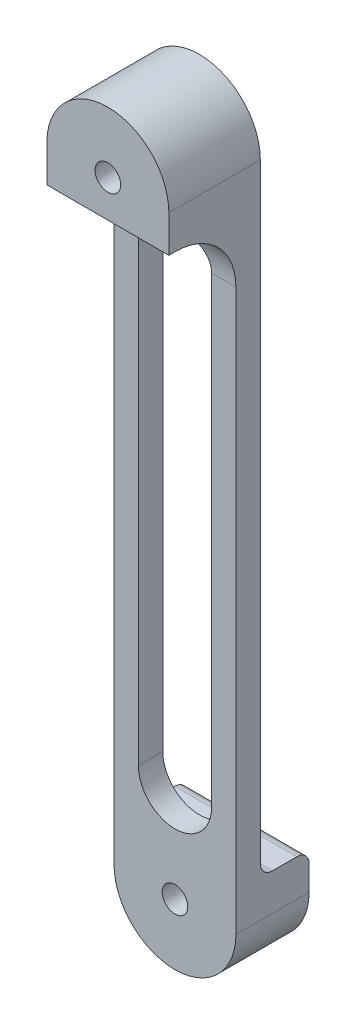
ISO-10303-21;
HEADER;
FILE_DESCRIPTION(('STEP AP214'),'2;1');
FILE_NAME('part.step','',(''),(''),'','','');
FILE_SCHEMA(('AUTOMOTIVE_DESIGN { 1 0 10303 214 1 1 1 1 }'));
ENDSEC;
DATA;
#1=APPLICATION_CONTEXT('core data for automotive mechanical design processes');
#2=APPLICATION_PROTOCOL_DEFINITION('international standard','automotive_design',2000,#1);
#3=PRODUCT_CONTEXT('',#1,'mechanical');
#4=PRODUCT('Part','Part','',(#3));
#5=PRODUCT_RELATED_PRODUCT_CATEGORY('part','',(#4));
#6=PRODUCT_DEFINITION_FORMATION('','',#4);
#7=PRODUCT_DEFINITION_CONTEXT('part definition',#1,'design');
#8=PRODUCT_DEFINITION('design','',#6,#7);
#9=PRODUCT_DEFINITION_SHAPE('','',#8);
#10=(LENGTH_UNIT() NAMED_UNIT(*) SI_UNIT(.MILLI.,.METRE.));
#11=(NAMED_UNIT(*) PLANE_ANGLE_UNIT() SI_UNIT($,.RADIAN.));
#12=(NAMED_UNIT(*) SI_UNIT($,.STERADIAN.) SOLID_ANGLE_UNIT());
#13=UNCERTAINTY_MEASURE_WITH_UNIT(LENGTH_MEASURE(1.E-05),#10,'distance_accuracy_value','');
#14=(GEOMETRIC_REPRESENTATION_CONTEXT(3) GLOBAL_UNCERTAINTY_ASSIGNED_CONTEXT((#13)) GLOBAL_UNIT_ASSIGNED_CONTEXT((#10,
#11,#12)) REPRESENTATION_CONTEXT('',''));
#15=CARTESIAN_POINT('',(0.,0.,0.));
#16=DIRECTION('',(0.,0.,1.));
#17=DIRECTION('',(1.,0.,0.));
#18=AXIS2_PLACEMENT_3D('',#15,#16,#17);
#19=CARTESIAN_POINT('',(0.,0.,4.));
#20=DIRECTION('',(0.,0.,1.));
#21=DIRECTION('',(1.,0.,0.));
#22=AXIS2_PLACEMENT_3D('',#19,#20,#21);
#23=PLANE('',#22);
#24=CARTESIAN_POINT('',(0.,-54.,4.));
#25=DIRECTION('',(0.,0.,1.));
#26=DIRECTION('',(1.,0.,0.));
#27=AXIS2_PLACEMENT_3D('',#24,#25,#26);
#28=CIRCLE('',#27,2.1);
#29=CARTESIAN_POINT('',(2.09999999999999,-54.,4.));
#30=VERTEX_POINT('',#29);
#31=EDGE_CURVE('E345',#30,#30,#28,.T.);
#32=ORIENTED_EDGE('',*,*,#31,.F.);
#33=EDGE_LOOP('',(#32));
#34=FACE_BOUND('',#33,.T.);
#35=DIRECTION('',(0.,-1.,0.));
#36=VECTOR('',#35,1.);
#37=CARTESIAN_POINT('',(10.,0.,4.));
#38=LINE('',#37,#36);
#39=CARTESIAN_POINT('',(10.,37.95,4.));
#40=VERTEX_POINT('',#39);
#41=CARTESIAN_POINT('',(9.99999999999999,-54.,4.));
#42=VERTEX_POINT('',#41);
#43=EDGE_CURVE('E350',#40,#42,#38,.T.);
#44=ORIENTED_EDGE('',*,*,#43,.F.);
#45=DIRECTION('',(-1.,0.,0.));
#46=VECTOR('',#45,1.);
#47=CARTESIAN_POINT('',(0.,37.95,4.));
#48=LINE('',#47,#46);
#49=CARTESIAN_POINT('',(5.99999999999999,37.95,4.));
#50=VERTEX_POINT('',#49);
#51=EDGE_CURVE('E450',#40,#50,#48,.T.);
#52=ORIENTED_EDGE('',*,*,#51,.T.);
#53=DIRECTION('',(0.,-1.,0.));
#54=VECTOR('',#53,1.);
#55=CARTESIAN_POINT('',(5.99999999999999,0.,4.));
#56=LINE('',#55,#54);
#57=CARTESIAN_POINT('',(5.99999999999999,-38.,4.));
#58=VERTEX_POINT('',#57);
#59=EDGE_CURVE('E363',#50,#58,#56,.T.);
#60=ORIENTED_EDGE('',*,*,#59,.T.);
#61=CARTESIAN_POINT('',(0.,-38.,4.));
#62=DIRECTION('',(0.,0.,1.));
#63=DIRECTION('',(1.,0.,0.));
#64=AXIS2_PLACEMENT_3D('',#61,#62,#63);
#65=CIRCLE('',#64,6.00000000000001);
#66=CARTESIAN_POINT('',(-6.00000000000002,-38.,4.));
#67=VERTEX_POINT('',#66);
#68=EDGE_CURVE('E354',#67,#58,#65,.T.);
#69=ORIENTED_EDGE('',*,*,#68,.F.);
#70=DIRECTION('',(0.,-1.,0.));
#71=VECTOR('',#70,1.);
#72=CARTESIAN_POINT('',(-6.00000000000002,0.,4.));
#73=LINE('',#72,#71);
#74=CARTESIAN_POINT('',(-6.00000000000002,37.95,4.));
#75=VERTEX_POINT('',#74);
#76=EDGE_CURVE('E356',#75,#67,#73,.T.);
#77=ORIENTED_EDGE('',*,*,#76,.F.);
#78=DIRECTION('',(-1.,0.,0.));
#79=VECTOR('',#78,1.);
#80=CARTESIAN_POINT('',(0.,37.95,4.));
#81=LINE('',#80,#79);
#82=CARTESIAN_POINT('',(-9.99999999999999,37.95,4.));
#83=VERTEX_POINT('',#82);
#84=EDGE_CURVE('E443',#75,#83,#81,.T.);
#85=ORIENTED_EDGE('',*,*,#84,.T.);
#86=DIRECTION('',(0.,-1.,0.));
#87=VECTOR('',#86,1.);
#88=CARTESIAN_POINT('',(-9.99999999999999,0.,4.));
#89=LINE('',#88,#87);
#90=CARTESIAN_POINT('',(-9.99999999999999,-54.,4.));
#91=VERTEX_POINT('',#90);
#92=EDGE_CURVE('E349',#83,#91,#89,.T.);
#93=ORIENTED_EDGE('',*,*,#92,.T.);
#94=CARTESIAN_POINT('',(0.,-54.,4.));
#95=DIRECTION('',(0.,0.,1.));
#96=DIRECTION('',(1.,0.,0.));
#97=AXIS2_PLACEMENT_3D('',#94,#95,#96);
#98=CIRCLE('',#97,10.);
#99=EDGE_CURVE('E406',#91,#42,#98,.T.);
#100=ORIENTED_EDGE('',*,*,#99,.T.);
#101=EDGE_LOOP('',(#44,#52,#60,#69,#77,#85,#93,#100));
#102=FACE_BOUND('',#101,.T.);
#103=ADVANCED_FACE('F165',(#34,#102),#23,.T.);
#104=CARTESIAN_POINT('',(0.,0.,0.));
#105=DIRECTION('',(0.,0.,1.));
#106=DIRECTION('',(1.,0.,0.));
#107=AXIS2_PLACEMENT_3D('',#104,#105,#106);
#108=PLANE('',#107);
#109=CARTESIAN_POINT('',(0.,-38.,0.));
#110=DIRECTION('',(0.,0.,1.));
#111=DIRECTION('',(1.,0.,0.));
#112=AXIS2_PLACEMENT_3D('',#109,#110,#111);
#113=CIRCLE('',#112,6.00000000000001);
#114=CARTESIAN_POINT('',(-6.00000000000002,-38.,0.));
#115=VERTEX_POINT('',#114);
#116=CARTESIAN_POINT('',(5.99999999999999,-38.,0.));
#117=VERTEX_POINT('',#116);
#118=EDGE_CURVE('E380',#115,#117,#113,.T.);
#119=ORIENTED_EDGE('',*,*,#118,.T.);
#120=DIRECTION('',(0.,-1.,0.));
#121=VECTOR('',#120,1.);
#122=CARTESIAN_POINT('',(5.99999999999999,0.,0.));
#123=LINE('',#122,#121);
#124=CARTESIAN_POINT('',(5.99999999999999,38.,0.));
#125=VERTEX_POINT('',#124);
#126=EDGE_CURVE('E353',#125,#117,#123,.T.);
#127=ORIENTED_EDGE('',*,*,#126,.F.);
#128=CARTESIAN_POINT('',(0.,38.,0.));
#129=DIRECTION('',(0.,0.,1.));
#130=DIRECTION('',(1.,0.,0.));
#131=AXIS2_PLACEMENT_3D('',#128,#129,#130);
#132=CIRCLE('',#131,6.00000000000001);
#133=CARTESIAN_POINT('',(-6.00000000000002,38.,0.));
#134=VERTEX_POINT('',#133);
#135=EDGE_CURVE('E383',#125,#134,#132,.T.);
#136=ORIENTED_EDGE('',*,*,#135,.T.);
#137=DIRECTION('',(0.,-1.,0.));
#138=VECTOR('',#137,1.);
#139=CARTESIAN_POINT('',(-6.00000000000002,0.,0.));
#140=LINE('',#139,#138);
#141=EDGE_CURVE('E382',#134,#115,#140,.T.);
#142=ORIENTED_EDGE('',*,*,#141,.T.);
#143=EDGE_LOOP('',(#119,#127,#136,#142));
#144=FACE_BOUND('',#143,.T.);
#145=DIRECTION('',(1.,0.,0.));
#146=VECTOR('',#145,1.);
#147=CARTESIAN_POINT('',(-9.99999999999999,-45.95,0.));
#148=LINE('',#147,#146);
#149=CARTESIAN_POINT('',(10.,-45.95,0.));
#150=VERTEX_POINT('',#149);
#151=CARTESIAN_POINT('',(-9.99999999999999,-45.95,0.));
#152=VERTEX_POINT('',#151);
#153=EDGE_CURVE('E432',#150,#152,#148,.F.);
#154=ORIENTED_EDGE('',*,*,#153,.T.);
#155=DIRECTION('',(0.,-1.,0.));
#156=VECTOR('',#155,1.);
#157=CARTESIAN_POINT('',(-9.99999999999999,0.,0.));
#158=LINE('',#157,#156);
#159=CARTESIAN_POINT('',(-9.99999999999999,54.,0.));
#160=VERTEX_POINT('',#159);
#161=EDGE_CURVE('E372',#160,#152,#158,.T.);
#162=ORIENTED_EDGE('',*,*,#161,.F.);
#163=CARTESIAN_POINT('',(0.,54.,0.));
#164=DIRECTION('',(0.,0.,1.));
#165=DIRECTION('',(1.,0.,0.));
#166=AXIS2_PLACEMENT_3D('',#163,#164,#165);
#167=CIRCLE('',#166,10.);
#168=CARTESIAN_POINT('',(10.,54.,0.));
#169=VERTEX_POINT('',#168);
#170=EDGE_CURVE('E371',#169,#160,#167,.T.);
#171=ORIENTED_EDGE('',*,*,#170,.F.);
#172=DIRECTION('',(0.,-1.,0.));
#173=VECTOR('',#172,1.);
#174=CARTESIAN_POINT('',(10.,0.,0.));
#175=LINE('',#174,#173);
#176=EDGE_CURVE('E284',#169,#150,#175,.T.);
#177=ORIENTED_EDGE('',*,*,#176,.T.);
#178=EDGE_LOOP('',(#154,#162,#171,#177));
#179=FACE_BOUND('',#178,.T.);
#180=CARTESIAN_POINT('',(0.,54.,0.));
#181=DIRECTION('',(0.,0.,1.));
#182=DIRECTION('',(1.,0.,0.));
#183=AXIS2_PLACEMENT_3D('',#180,#181,#182);
#184=CIRCLE('',#183,2.1);
#185=CARTESIAN_POINT('',(2.09999999999999,54.,0.));
#186=VERTEX_POINT('',#185);
#187=EDGE_CURVE('E364',#186,#186,#184,.T.);
#188=ORIENTED_EDGE('',*,*,#187,.T.);
#189=EDGE_LOOP('',(#188));
#190=FACE_BOUND('',#189,.T.);
#191=ADVANCED_FACE('F495',(#144,#179,#190),#108,.F.);
#192=CARTESIAN_POINT('',(0.,54.,4.));
#193=DIRECTION('',(0.,0.,-1.));
#194=DIRECTION('',(-1.,0.,0.));
#195=AXIS2_PLACEMENT_3D('',#192,#193,#194);
#196=CYLINDRICAL_SURFACE('',#195,2.1);
#197=ORIENTED_EDGE('',*,*,#187,.F.);
#198=EDGE_LOOP('',(#197));
#199=FACE_BOUND('',#198,.T.);
#200=CARTESIAN_POINT('',(0.,54.,15.));
#201=DIRECTION('',(0.,0.,1.));
#202=DIRECTION('',(1.,0.,0.));
#203=AXIS2_PLACEMENT_3D('',#200,#201,#202);
#204=CIRCLE('',#203,2.1);
#205=CARTESIAN_POINT('',(2.09999999999999,54.,15.));
#206=VERTEX_POINT('',#205);
#207=EDGE_CURVE('E310',#206,#206,#204,.T.);
#208=ORIENTED_EDGE('',*,*,#207,.T.);
#209=EDGE_LOOP('',(#208));
#210=FACE_BOUND('',#209,.T.);
#211=ADVANCED_FACE('F490',(#199,#210),#196,.F.);
#212=CARTESIAN_POINT('',(5.99999999999999,0.,4.));
#213=DIRECTION('',(1.,0.,0.));
#214=DIRECTION('',(0.,0.,-1.));
#215=AXIS2_PLACEMENT_3D('',#212,#213,#214);
#216=PLANE('',#215);
#217=ORIENTED_EDGE('',*,*,#126,.T.);
#218=DIRECTION('',(0.,0.,-1.));
#219=VECTOR('',#218,1.);
#220=CARTESIAN_POINT('',(5.99999999999999,-38.,4.));
#221=LINE('',#220,#219);
#222=EDGE_CURVE('E287',#58,#117,#221,.T.);
#223=ORIENTED_EDGE('',*,*,#222,.F.);
#224=ORIENTED_EDGE('',*,*,#59,.F.);
#225=CARTESIAN_POINT('',(5.99999999999999,37.95,14.));
#226=DIRECTION('',(1.,0.,0.));
#227=DIRECTION('',(0.,0.,-1.));
#228=AXIS2_PLACEMENT_3D('',#225,#226,#227);
#229=CIRCLE('',#228,10.);
#230=CARTESIAN_POINT('',(5.99999999999999,38.,4.00012500078126));
#231=VERTEX_POINT('',#230);
#232=EDGE_CURVE('E453',#50,#231,#229,.T.);
#233=ORIENTED_EDGE('',*,*,#232,.T.);
#234=DIRECTION('',(0.,0.,-1.));
#235=VECTOR('',#234,1.);
#236=CARTESIAN_POINT('',(5.99999999999999,38.,4.));
#237=LINE('',#236,#235);
#238=EDGE_CURVE('E189',#231,#125,#237,.T.);
#239=ORIENTED_EDGE('',*,*,#238,.T.);
#240=EDGE_LOOP('',(#217,#223,#224,#233,#239));
#241=FACE_BOUND('',#240,.T.);
#242=ADVANCED_FACE('F471',(#241),#216,.F.);
#243=CARTESIAN_POINT('',(0.,-38.,4.));
#244=DIRECTION('',(0.,0.,-1.));
#245=DIRECTION('',(-1.,0.,0.));
#246=AXIS2_PLACEMENT_3D('',#243,#244,#245);
#247=CYLINDRICAL_SURFACE('',#246,6.00000000000001);
#248=ORIENTED_EDGE('',*,*,#118,.F.);
#249=DIRECTION('',(0.,0.,-1.));
#250=VECTOR('',#249,1.);
#251=CARTESIAN_POINT('',(-6.00000000000002,-38.,4.));
#252=LINE('',#251,#250);
#253=EDGE_CURVE('E396',#67,#115,#252,.T.);
#254=ORIENTED_EDGE('',*,*,#253,.F.);
#255=ORIENTED_EDGE('',*,*,#68,.T.);
#256=ORIENTED_EDGE('',*,*,#222,.T.);
#257=EDGE_LOOP('',(#248,#254,#255,#256));
#258=FACE_BOUND('',#257,.T.);
#259=ADVANCED_FACE('F476',(#258),#247,.F.);
#260=CARTESIAN_POINT('',(-6.00000000000002,0.,4.));
#261=DIRECTION('',(1.,0.,0.));
#262=DIRECTION('',(0.,0.,-1.));
#263=AXIS2_PLACEMENT_3D('',#260,#261,#262);
#264=PLANE('',#263);
#265=ORIENTED_EDGE('',*,*,#141,.F.);
#266=DIRECTION('',(0.,0.,-1.));
#267=VECTOR('',#266,1.);
#268=CARTESIAN_POINT('',(-6.00000000000002,38.,4.));
#269=LINE('',#268,#267);
#270=CARTESIAN_POINT('',(-6.00000000000002,38.,4.00012500078126));
#271=VERTEX_POINT('',#270);
#272=EDGE_CURVE('E181',#271,#134,#269,.T.);
#273=ORIENTED_EDGE('',*,*,#272,.F.);
#274=CARTESIAN_POINT('',(-6.00000000000002,37.95,14.));
#275=DIRECTION('',(1.,0.,0.));
#276=DIRECTION('',(0.,0.,-1.));
#277=AXIS2_PLACEMENT_3D('',#274,#275,#276);
#278=CIRCLE('',#277,10.);
#279=EDGE_CURVE('E462',#271,#75,#278,.F.);
#280=ORIENTED_EDGE('',*,*,#279,.T.);
#281=ORIENTED_EDGE('',*,*,#76,.T.);
#282=ORIENTED_EDGE('',*,*,#253,.T.);
#283=EDGE_LOOP('',(#265,#273,#280,#281,#282));
#284=FACE_BOUND('',#283,.T.);
#285=ADVANCED_FACE('F474',(#284),#264,.T.);
#286=CARTESIAN_POINT('',(0.,38.,4.));
#287=DIRECTION('',(0.,0.,-1.));
#288=DIRECTION('',(-1.,0.,0.));
#289=AXIS2_PLACEMENT_3D('',#286,#287,#288);
#290=CYLINDRICAL_SURFACE('',#289,6.00000000000001);
#291=ORIENTED_EDGE('',*,*,#135,.F.);
#292=ORIENTED_EDGE('',*,*,#238,.F.);
#293=CARTESIAN_POINT('',(5.99999999999999,38.,4.00012500078126));
#294=CARTESIAN_POINT('',(6.00002939083583,38.154507143992,4.00086547031456));
#295=CARTESIAN_POINT('',(5.99403326209707,38.3089780883362,4.00524964376126));
#296=CARTESIAN_POINT('',(5.97022052073416,38.6165658194928,4.02106116575261));
#297=CARTESIAN_POINT('',(5.95241000302225,38.76968326331,4.03248488245925));
#298=CARTESIAN_POINT('',(5.9053297611394,39.0726001315191,4.06205015469161));
#299=CARTESIAN_POINT('',(5.87612425623474,39.2224132645177,4.08015403201983));
#300=CARTESIAN_POINT('',(5.80664764882747,39.518542885166,4.12265000098556));
#301=CARTESIAN_POINT('',(5.76637559263102,39.6648590702737,4.14704263456463));
#302=CARTESIAN_POINT('',(5.67533587877572,39.9527698086519,4.20151376414533));
#303=CARTESIAN_POINT('',(5.6245890820783,40.0943731067213,4.23158094895563));
#304=CARTESIAN_POINT('',(5.51309172107004,40.3724004882208,4.29678380996929));
#305=CARTESIAN_POINT('',(5.4523372833014,40.5088225409914,4.33192144803638));
#306=CARTESIAN_POINT('',(5.25579471408874,40.9094749859546,4.44394134771774));
#307=CARTESIAN_POINT('',(5.10574575154683,41.1650341745822,4.52741928434389));
#308=CARTESIAN_POINT('',(4.75933698537586,41.6672924380106,4.71242961355549));
#309=CARTESIAN_POINT('',(4.56029809817396,41.9117882696681,4.81485788276022));
#310=CARTESIAN_POINT('',(4.12742015277562,42.3661070883597,5.0244463913948));
#311=CARTESIAN_POINT('',(3.89354184935264,42.575890403222,5.13161187011073));
#312=CARTESIAN_POINT('',(3.50413802257699,42.8736170479029,5.29523059593231));
#313=CARTESIAN_POINT('',(3.35914808322376,42.9746874956255,5.35334153847096));
#314=CARTESIAN_POINT('',(3.05981877922376,43.1641913582405,5.46628128839135));
#315=CARTESIAN_POINT('',(2.9054778382335,43.2526226339995,5.52110953927929));
#316=CARTESIAN_POINT('',(2.58835009704273,43.4159224710511,5.62545056533217));
#317=CARTESIAN_POINT('',(2.42557525139034,43.4908095884909,5.67497057454435));
#318=CARTESIAN_POINT('',(2.09222022447754,43.6262729452321,5.76673665632813));
#319=CARTESIAN_POINT('',(1.92164309476524,43.6868547233164,5.80898554243054));
#320=CARTESIAN_POINT('',(1.61684857703668,43.7796656526235,5.87489159307925));
#321=CARTESIAN_POINT('',(1.48406544248432,43.8152015921774,5.90056295131265));
#322=CARTESIAN_POINT('',(1.21539817699264,43.877227418595,5.94584246319028));
#323=CARTESIAN_POINT('',(1.07951475344839,43.9037193474456,5.96545198540143));
#324=CARTESIAN_POINT('',(0.80558784794996,43.9472885508045,5.99792086888849));
#325=CARTESIAN_POINT('',(0.66754673512977,43.9643754947432,6.01078716234295));
#326=CARTESIAN_POINT('',(0.390121715352987,43.9889226881354,6.02932552847361));
#327=CARTESIAN_POINT('',(0.250737784818412,43.9963827682435,6.03499747459441));
#328=CARTESIAN_POINT('',(-0.0285939414456777,44.0015608966096,6.03893084764975));
#329=CARTESIAN_POINT('',(-0.168542307212214,43.9992596056088,6.03717756370604));
#330=CARTESIAN_POINT('',(-0.447644808733899,43.9849096788342,6.02629669471779));
#331=CARTESIAN_POINT('',(-0.586798940582538,43.9728609951587,6.01716907343335));
#332=CARTESIAN_POINT('',(-0.86336103899371,43.939193237123,5.99187869976622));
#333=CARTESIAN_POINT('',(-1.00076817480634,43.9175697727833,5.97571272039546));
#334=CARTESIAN_POINT('',(-1.27289542171672,43.8650637984639,5.93693139329176));
#335=CARTESIAN_POINT('',(-1.40761440911319,43.8341774994654,5.91431340651118));
#336=CARTESIAN_POINT('',(-1.80301808105739,43.7291107652676,5.83854670734071));
#337=CARTESIAN_POINT('',(-2.05881702037162,43.6420347411817,5.77709559859611));
#338=CARTESIAN_POINT('',(-2.55266470087875,43.4365137423388,5.63857282737473));
#339=CARTESIAN_POINT('',(-2.7907070929769,43.3180576154518,5.56149561384905));
#340=CARTESIAN_POINT('',(-3.28753629310624,43.0287837750692,5.38376195179665));
#341=CARTESIAN_POINT('',(-3.54248796501897,42.8524011789913,5.28134964291071));
#342=CARTESIAN_POINT('',(-3.90174132061494,42.5607327773719,5.12569010330937));
#343=CARTESIAN_POINT('',(-4.01771434440818,42.4589010186014,5.0734203748056));
#344=CARTESIAN_POINT('',(-4.24161431937689,42.2464703128573,4.9692570043463));
#345=CARTESIAN_POINT('',(-4.34953987160121,42.1358698484179,4.91736342918919));
#346=CARTESIAN_POINT('',(-4.57180564797116,41.8897200789358,4.8076504497226));
#347=CARTESIAN_POINT('',(-4.68482414773124,41.7528736565987,4.75005653202049));
#348=CARTESIAN_POINT('',(-4.89885031965715,41.4688424629972,4.63832147874184));
#349=CARTESIAN_POINT('',(-4.99986231764634,41.3216614457734,4.58417910288891));
#350=CARTESIAN_POINT('',(-5.18899929595708,41.0176680954214,4.48079950621321));
#351=CARTESIAN_POINT('',(-5.27712855973611,40.8608589883328,4.43156065673118));
#352=CARTESIAN_POINT('',(-5.43954242887465,40.5384893921876,4.33936845038697));
#353=CARTESIAN_POINT('',(-5.51383123890273,40.3729315806324,4.29641318545434));
#354=CARTESIAN_POINT('',(-5.63459197744694,40.06710267356,4.22567060802194));
#355=CARTESIAN_POINT('',(-5.68366438160099,39.9281594190905,4.19655747461003));
#356=CARTESIAN_POINT('',(-5.771672446473,39.6460898950165,4.14384202123668));
#357=CARTESIAN_POINT('',(-5.81061002657747,39.5029644231817,4.12023865789337));
#358=CARTESIAN_POINT('',(-5.87783804757158,39.2136845587516,4.07909244981726));
#359=CARTESIAN_POINT('',(-5.90614948246116,39.0675367469166,4.06153766064934));
#360=CARTESIAN_POINT('',(-5.95186466771844,38.772979602501,4.03282503937151));
#361=CARTESIAN_POINT('',(-5.96927428091024,38.624571529517,4.02166376920578));
#362=CARTESIAN_POINT('',(-5.98741007780367,38.3965092779093,4.00965920460311));
#363=CARTESIAN_POINT('',(-5.99213145131949,38.3172732034211,4.0064318668314));
#364=CARTESIAN_POINT('',(-5.99842537406111,38.1586963558147,4.00186337682725));
#365=CARTESIAN_POINT('',(-6.00000087032467,38.079355750425,4.00052045963258));
#366=CARTESIAN_POINT('',(-6.00000000000001,38.,4.00012500078126));
#367=B_SPLINE_CURVE_WITH_KNOTS('',3,(#293,#294,#295,#296,#297,#298,#299,#300,#301,#302,#303,
#304,#305,#306,#307,#308,#309,#310,#311,#312,#313,#314,#315,#316,#317,#318,#319,#320,#321,#322,
#323,#324,#325,#326,#327,#328,#329,#330,#331,#332,#333,#334,#335,#336,#337,#338,#339,#340,#341,
#342,#343,#344,#345,#346,#347,#348,#349,#350,#351,#352,#353,#354,#355,#356,#357,#358,#359,#360,
#361,#362,#363,#364,#365,#366),.UNSPECIFIED.,.F.,.F.,(4,2,2,2,2,2,2,2,2,2,2,2,2,2,2,2,2,2,2,2,2,
2,2,2,2,2,2,2,2,2,2,2,2,2,2,2,4),(0.,0.463340029255992,0.92644121223591,1.38696932082661,
1.84753712928621,2.30719639430972,2.76703399031824,3.68689138783057,4.67768846071744,
5.66961018749158,6.22718035004249,6.78484476782937,7.34173927334413,7.89841780397529,
8.31749954053823,8.73648659275393,9.1550420685398,9.57360490701207,9.99299739041254,
10.4123919348575,10.8319789686211,11.2517378716601,12.0796384434759,12.907833637336,
13.8832598662326,14.3717625772077,14.8603500111737,15.4194422477656,15.9783324344408,
16.5370363676144,17.0955702912468,17.5457123614892,17.9957691193176,18.4449319632436,
18.8938530467104,19.1321047368419,19.3701331294001),.UNSPECIFIED.);
#368=EDGE_CURVE('E460',#231,#271,#367,.T.);
#369=ORIENTED_EDGE('',*,*,#368,.T.);
#370=ORIENTED_EDGE('',*,*,#272,.T.);
#371=EDGE_LOOP('',(#291,#292,#369,#370));
#372=FACE_BOUND('',#371,.T.);
#373=ADVANCED_FACE('F467',(#372),#290,.F.);
#374=CARTESIAN_POINT('',(10.,0.,4.));
#375=DIRECTION('',(1.,0.,0.));
#376=DIRECTION('',(0.,0.,-1.));
#377=AXIS2_PLACEMENT_3D('',#374,#375,#376);
#378=PLANE('',#377);
#379=CARTESIAN_POINT('',(10.,-45.95,-2.));
#380=DIRECTION('',(1.,0.,0.));
#381=DIRECTION('',(0.,0.,-1.));
#382=AXIS2_PLACEMENT_3D('',#379,#380,#381);
#383=CIRCLE('',#382,2.);
#384=CARTESIAN_POINT('',(10.,-47.95,-2.));
#385=VERTEX_POINT('',#384);
#386=EDGE_CURVE('E438',#385,#150,#383,.F.);
#387=ORIENTED_EDGE('',*,*,#386,.T.);
#388=ORIENTED_EDGE('',*,*,#176,.F.);
#389=DIRECTION('',(0.,0.,-1.));
#390=VECTOR('',#389,1.);
#391=CARTESIAN_POINT('',(10.,54.,4.));
#392=LINE('',#391,#390);
#393=CARTESIAN_POINT('',(10.,54.,15.));
#394=VERTEX_POINT('',#393);
#395=EDGE_CURVE('E280',#394,#169,#392,.T.);
#396=ORIENTED_EDGE('',*,*,#395,.F.);
#397=DIRECTION('',(0.,-1.,0.));
#398=VECTOR('',#397,1.);
#399=CARTESIAN_POINT('',(10.,0.,15.));
#400=LINE('',#399,#398);
#401=CARTESIAN_POINT('',(10.,47.95,15.));
#402=VERTEX_POINT('',#401);
#403=EDGE_CURVE('E283',#394,#402,#400,.T.);
#404=ORIENTED_EDGE('',*,*,#403,.T.);
#405=DIRECTION('',(0.,0.,-1.));
#406=VECTOR('',#405,1.);
#407=CARTESIAN_POINT('',(10.,47.95,15.));
#408=LINE('',#407,#406);
#409=CARTESIAN_POINT('',(10.,47.95,14.));
#410=VERTEX_POINT('',#409);
#411=EDGE_CURVE('E320',#402,#410,#408,.T.);
#412=ORIENTED_EDGE('',*,*,#411,.T.);
#413=CARTESIAN_POINT('',(10.,37.95,14.));
#414=DIRECTION('',(1.,0.,0.));
#415=DIRECTION('',(0.,0.,-1.));
#416=AXIS2_PLACEMENT_3D('',#413,#414,#415);
#417=CIRCLE('',#416,10.);
#418=EDGE_CURVE('E12',#410,#40,#417,.F.);
#419=ORIENTED_EDGE('',*,*,#418,.T.);
#420=ORIENTED_EDGE('',*,*,#43,.T.);
#421=DIRECTION('',(0.,0.,-1.));
#422=VECTOR('',#421,1.);
#423=CARTESIAN_POINT('',(9.99999999999999,-54.,4.));
#424=LINE('',#423,#422);
#425=CARTESIAN_POINT('',(10.,-54.,-8.));
#426=VERTEX_POINT('',#425);
#427=EDGE_CURVE('E411',#42,#426,#424,.T.);
#428=ORIENTED_EDGE('',*,*,#427,.T.);
#429=DIRECTION('',(0.,-1.,0.));
#430=VECTOR('',#429,1.);
#431=CARTESIAN_POINT('',(10.,0.,-8.));
#432=LINE('',#431,#430);
#433=CARTESIAN_POINT('',(10.,-49.95,-8.));
#434=VERTEX_POINT('',#433);
#435=EDGE_CURVE('E332',#434,#426,#432,.T.);
#436=ORIENTED_EDGE('',*,*,#435,.F.);
#437=CARTESIAN_POINT('',(10.,-49.95,-6.));
#438=DIRECTION('',(1.,0.,0.));
#439=DIRECTION('',(0.,0.,-1.));
#440=AXIS2_PLACEMENT_3D('',#437,#438,#439);
#441=CIRCLE('',#440,2.);
#442=CARTESIAN_POINT('',(10.,-47.95,-6.));
#443=VERTEX_POINT('',#442);
#444=EDGE_CURVE('E423',#434,#443,#441,.T.);
#445=ORIENTED_EDGE('',*,*,#444,.T.);
#446=DIRECTION('',(0.,0.,1.));
#447=VECTOR('',#446,1.);
#448=CARTESIAN_POINT('',(10.,-47.95,-8.));
#449=LINE('',#448,#447);
#450=EDGE_CURVE('E336',#443,#385,#449,.T.);
#451=ORIENTED_EDGE('',*,*,#450,.T.);
#452=EDGE_LOOP('',(#387,#388,#396,#404,#412,#419,#420,#428,#436,#445,#451));
#453=FACE_BOUND('',#452,.T.);
#454=ADVANCED_FACE('F281',(#453),#378,.T.);
#455=CARTESIAN_POINT('',(-9.99999999999999,0.,4.));
#456=DIRECTION('',(1.,0.,0.));
#457=DIRECTION('',(0.,0.,-1.));
#458=AXIS2_PLACEMENT_3D('',#455,#456,#457);
#459=PLANE('',#458);
#460=ORIENTED_EDGE('',*,*,#92,.F.);
#461=CARTESIAN_POINT('',(-9.99999999999999,37.95,14.));
#462=DIRECTION('',(1.,0.,0.));
#463=DIRECTION('',(0.,0.,-1.));
#464=AXIS2_PLACEMENT_3D('',#461,#462,#463);
#465=CIRCLE('',#464,10.);
#466=CARTESIAN_POINT('',(-9.99999999999999,47.95,14.));
#467=VERTEX_POINT('',#466);
#468=EDGE_CURVE('E172',#83,#467,#465,.T.);
#469=ORIENTED_EDGE('',*,*,#468,.T.);
#470=DIRECTION('',(0.,0.,-1.));
#471=VECTOR('',#470,1.);
#472=CARTESIAN_POINT('',(-9.99999999999999,47.95,15.));
#473=LINE('',#472,#471);
#474=CARTESIAN_POINT('',(-9.99999999999999,47.95,15.));
#475=VERTEX_POINT('',#474);
#476=EDGE_CURVE('E318',#475,#467,#473,.T.);
#477=ORIENTED_EDGE('',*,*,#476,.F.);
#478=DIRECTION('',(0.,-1.,0.));
#479=VECTOR('',#478,1.);
#480=CARTESIAN_POINT('',(-9.99999999999999,0.,15.));
#481=LINE('',#480,#479);
#482=CARTESIAN_POINT('',(-9.99999999999999,54.,15.));
#483=VERTEX_POINT('',#482);
#484=EDGE_CURVE('E301',#483,#475,#481,.T.);
#485=ORIENTED_EDGE('',*,*,#484,.F.);
#486=DIRECTION('',(0.,0.,-1.));
#487=VECTOR('',#486,1.);
#488=CARTESIAN_POINT('',(-9.99999999999999,54.,4.));
#489=LINE('',#488,#487);
#490=EDGE_CURVE('E293',#483,#160,#489,.T.);
#491=ORIENTED_EDGE('',*,*,#490,.T.);
#492=ORIENTED_EDGE('',*,*,#161,.T.);
#493=CARTESIAN_POINT('',(-9.99999999999999,-45.95,-2.));
#494=DIRECTION('',(1.,0.,0.));
#495=DIRECTION('',(0.,0.,-1.));
#496=AXIS2_PLACEMENT_3D('',#493,#494,#495);
#497=CIRCLE('',#496,2.);
#498=CARTESIAN_POINT('',(-9.99999999999999,-47.95,-2.));
#499=VERTEX_POINT('',#498);
#500=EDGE_CURVE('E441',#152,#499,#497,.T.);
#501=ORIENTED_EDGE('',*,*,#500,.T.);
#502=DIRECTION('',(0.,0.,1.));
#503=VECTOR('',#502,1.);
#504=CARTESIAN_POINT('',(-9.99999999999999,-47.95,-8.));
#505=LINE('',#504,#503);
#506=CARTESIAN_POINT('',(-9.99999999999999,-47.95,-6.));
#507=VERTEX_POINT('',#506);
#508=EDGE_CURVE('E339',#507,#499,#505,.T.);
#509=ORIENTED_EDGE('',*,*,#508,.F.);
#510=CARTESIAN_POINT('',(-9.99999999999999,-49.95,-6.));
#511=DIRECTION('',(1.,0.,0.));
#512=DIRECTION('',(0.,0.,-1.));
#513=AXIS2_PLACEMENT_3D('',#510,#511,#512);
#514=CIRCLE('',#513,2.);
#515=CARTESIAN_POINT('',(-9.99999999999999,-49.95,-8.));
#516=VERTEX_POINT('',#515);
#517=EDGE_CURVE('E431',#507,#516,#514,.F.);
#518=ORIENTED_EDGE('',*,*,#517,.T.);
#519=DIRECTION('',(0.,-1.,0.));
#520=VECTOR('',#519,1.);
#521=CARTESIAN_POINT('',(-9.99999999999999,0.,-8.));
#522=LINE('',#521,#520);
#523=CARTESIAN_POINT('',(-9.99999999999999,-54.,-8.));
#524=VERTEX_POINT('',#523);
#525=EDGE_CURVE('E327',#516,#524,#522,.T.);
#526=ORIENTED_EDGE('',*,*,#525,.T.);
#527=DIRECTION('',(0.,0.,-1.));
#528=VECTOR('',#527,1.);
#529=CARTESIAN_POINT('',(-9.99999999999999,-54.,4.));
#530=LINE('',#529,#528);
#531=EDGE_CURVE('E368',#91,#524,#530,.T.);
#532=ORIENTED_EDGE('',*,*,#531,.F.);
#533=EDGE_LOOP('',(#460,#469,#477,#485,#491,#492,#501,#509,#518,#526,#532));
#534=FACE_BOUND('',#533,.T.);
#535=ADVANCED_FACE('F479',(#534),#459,.F.);
#536=CARTESIAN_POINT('',(0.,54.,4.));
#537=DIRECTION('',(0.,0.,-1.));
#538=DIRECTION('',(-1.,0.,0.));
#539=AXIS2_PLACEMENT_3D('',#536,#537,#538);
#540=CYLINDRICAL_SURFACE('',#539,10.);
#541=ORIENTED_EDGE('',*,*,#170,.T.);
#542=ORIENTED_EDGE('',*,*,#490,.F.);
#543=CARTESIAN_POINT('',(0.,54.,15.));
#544=DIRECTION('',(0.,0.,1.));
#545=DIRECTION('',(1.,0.,0.));
#546=AXIS2_PLACEMENT_3D('',#543,#544,#545);
#547=CIRCLE('',#546,10.);
#548=EDGE_CURVE('E295',#394,#483,#547,.T.);
#549=ORIENTED_EDGE('',*,*,#548,.F.);
#550=ORIENTED_EDGE('',*,*,#395,.T.);
#551=EDGE_LOOP('',(#541,#542,#549,#550));
#552=FACE_BOUND('',#551,.T.);
#553=ADVANCED_FACE('F294',(#552),#540,.T.);
#554=CARTESIAN_POINT('',(0.,-54.,4.));
#555=DIRECTION('',(0.,0.,-1.));
#556=DIRECTION('',(-1.,0.,0.));
#557=AXIS2_PLACEMENT_3D('',#554,#555,#556);
#558=CYLINDRICAL_SURFACE('',#557,2.1);
#559=ORIENTED_EDGE('',*,*,#31,.T.);
#560=EDGE_LOOP('',(#559));
#561=FACE_BOUND('',#560,.T.);
#562=CARTESIAN_POINT('',(0.,-54.,-8.));
#563=DIRECTION('',(0.,0.,1.));
#564=DIRECTION('',(1.,0.,0.));
#565=AXIS2_PLACEMENT_3D('',#562,#563,#564);
#566=CIRCLE('',#565,2.1);
#567=CARTESIAN_POINT('',(2.09999999999999,-54.,-8.));
#568=VERTEX_POINT('',#567);
#569=EDGE_CURVE('E323',#568,#568,#566,.T.);
#570=ORIENTED_EDGE('',*,*,#569,.F.);
#571=EDGE_LOOP('',(#570));
#572=FACE_BOUND('',#571,.T.);
#573=ADVANCED_FACE('F488',(#561,#572),#558,.F.);
#574=CARTESIAN_POINT('',(0.,-54.,4.));
#575=DIRECTION('',(0.,0.,-1.));
#576=DIRECTION('',(-1.,0.,0.));
#577=AXIS2_PLACEMENT_3D('',#574,#575,#576);
#578=CYLINDRICAL_SURFACE('',#577,10.);
#579=ORIENTED_EDGE('',*,*,#531,.T.);
#580=CARTESIAN_POINT('',(0.,-54.,-8.));
#581=DIRECTION('',(0.,0.,1.));
#582=DIRECTION('',(1.,0.,0.));
#583=AXIS2_PLACEMENT_3D('',#580,#581,#582);
#584=CIRCLE('',#583,10.);
#585=EDGE_CURVE('E333',#524,#426,#584,.T.);
#586=ORIENTED_EDGE('',*,*,#585,.T.);
#587=ORIENTED_EDGE('',*,*,#427,.F.);
#588=ORIENTED_EDGE('',*,*,#99,.F.);
#589=EDGE_LOOP('',(#579,#586,#587,#588));
#590=FACE_BOUND('',#589,.T.);
#591=ADVANCED_FACE('F496',(#590),#578,.T.);
#592=CARTESIAN_POINT('',(0.,-47.95,-8.));
#593=DIRECTION('',(0.,-1.,0.));
#594=DIRECTION('',(0.,0.,-1.));
#595=AXIS2_PLACEMENT_3D('',#592,#593,#594);
#596=PLANE('',#595);
#597=ORIENTED_EDGE('',*,*,#450,.F.);
#598=DIRECTION('',(1.,0.,0.));
#599=VECTOR('',#598,1.);
#600=CARTESIAN_POINT('',(0.,-47.95,-6.));
#601=LINE('',#600,#599);
#602=EDGE_CURVE('E426',#443,#507,#601,.F.);
#603=ORIENTED_EDGE('',*,*,#602,.T.);
#604=ORIENTED_EDGE('',*,*,#508,.T.);
#605=DIRECTION('',(1.,0.,0.));
#606=VECTOR('',#605,1.);
#607=CARTESIAN_POINT('',(10.,-47.95,-2.));
#608=LINE('',#607,#606);
#609=EDGE_CURVE('E425',#499,#385,#608,.T.);
#610=ORIENTED_EDGE('',*,*,#609,.T.);
#611=EDGE_LOOP('',(#597,#603,#604,#610));
#612=FACE_BOUND('',#611,.T.);
#613=ADVANCED_FACE('F499',(#612),#596,.F.);
#614=CARTESIAN_POINT('',(0.,0.,-8.));
#615=DIRECTION('',(0.,0.,1.));
#616=DIRECTION('',(1.,0.,0.));
#617=AXIS2_PLACEMENT_3D('',#614,#615,#616);
#618=PLANE('',#617);
#619=ORIENTED_EDGE('',*,*,#569,.T.);
#620=EDGE_LOOP('',(#619));
#621=FACE_BOUND('',#620,.T.);
#622=ORIENTED_EDGE('',*,*,#525,.F.);
#623=DIRECTION('',(1.,0.,0.));
#624=VECTOR('',#623,1.);
#625=CARTESIAN_POINT('',(0.,-49.95,-8.));
#626=LINE('',#625,#624);
#627=EDGE_CURVE('E402',#516,#434,#626,.T.);
#628=ORIENTED_EDGE('',*,*,#627,.T.);
#629=ORIENTED_EDGE('',*,*,#435,.T.);
#630=ORIENTED_EDGE('',*,*,#585,.F.);
#631=EDGE_LOOP('',(#622,#628,#629,#630));
#632=FACE_BOUND('',#631,.T.);
#633=ADVANCED_FACE('F504',(#621,#632),#618,.F.);
#634=CARTESIAN_POINT('',(0.,-49.95,-6.));
#635=DIRECTION('',(1.,0.,0.));
#636=DIRECTION('',(0.,0.,-1.));
#637=AXIS2_PLACEMENT_3D('',#634,#635,#636);
#638=CYLINDRICAL_SURFACE('',#637,2.);
#639=ORIENTED_EDGE('',*,*,#517,.F.);
#640=ORIENTED_EDGE('',*,*,#602,.F.);
#641=ORIENTED_EDGE('',*,*,#444,.F.);
#642=ORIENTED_EDGE('',*,*,#627,.F.);
#643=EDGE_LOOP('',(#639,#640,#641,#642));
#644=FACE_BOUND('',#643,.T.);
#645=ADVANCED_FACE('F505',(#644),#638,.T.);
#646=CARTESIAN_POINT('',(0.,-45.95,-2.));
#647=DIRECTION('',(-1.,0.,0.));
#648=DIRECTION('',(0.,0.,1.));
#649=AXIS2_PLACEMENT_3D('',#646,#647,#648);
#650=CYLINDRICAL_SURFACE('',#649,2.);
#651=ORIENTED_EDGE('',*,*,#500,.F.);
#652=ORIENTED_EDGE('',*,*,#153,.F.);
#653=ORIENTED_EDGE('',*,*,#386,.F.);
#654=ORIENTED_EDGE('',*,*,#609,.F.);
#655=EDGE_LOOP('',(#651,#652,#653,#654));
#656=FACE_BOUND('',#655,.T.);
#657=ADVANCED_FACE('F502',(#656),#650,.F.);
#658=CARTESIAN_POINT('',(0.,47.95,15.));
#659=DIRECTION('',(0.,1.,0.));
#660=DIRECTION('',(0.,0.,1.));
#661=AXIS2_PLACEMENT_3D('',#658,#659,#660);
#662=PLANE('',#661);
#663=ORIENTED_EDGE('',*,*,#476,.T.);
#664=DIRECTION('',(-1.,0.,0.));
#665=VECTOR('',#664,1.);
#666=CARTESIAN_POINT('',(0.,47.95,14.));
#667=LINE('',#666,#665);
#668=EDGE_CURVE('E454',#467,#410,#667,.F.);
#669=ORIENTED_EDGE('',*,*,#668,.T.);
#670=ORIENTED_EDGE('',*,*,#411,.F.);
#671=DIRECTION('',(1.,0.,0.));
#672=VECTOR('',#671,1.);
#673=CARTESIAN_POINT('',(0.,47.95,15.));
#674=LINE('',#673,#672);
#675=EDGE_CURVE('E302',#475,#402,#674,.T.);
#676=ORIENTED_EDGE('',*,*,#675,.F.);
#677=EDGE_LOOP('',(#663,#669,#670,#676));
#678=FACE_BOUND('',#677,.T.);
#679=ADVANCED_FACE('F507',(#678),#662,.F.);
#680=CARTESIAN_POINT('',(0.,0.,15.));
#681=DIRECTION('',(0.,0.,1.));
#682=DIRECTION('',(1.,0.,0.));
#683=AXIS2_PLACEMENT_3D('',#680,#681,#682);
#684=PLANE('',#683);
#685=ORIENTED_EDGE('',*,*,#207,.F.);
#686=EDGE_LOOP('',(#685));
#687=FACE_BOUND('',#686,.T.);
#688=ORIENTED_EDGE('',*,*,#403,.F.);
#689=ORIENTED_EDGE('',*,*,#548,.T.);
#690=ORIENTED_EDGE('',*,*,#484,.T.);
#691=ORIENTED_EDGE('',*,*,#675,.T.);
#692=EDGE_LOOP('',(#688,#689,#690,#691));
#693=FACE_BOUND('',#692,.T.);
#694=ADVANCED_FACE('F303',(#687,#693),#684,.T.);
#695=CARTESIAN_POINT('',(0.,37.95,14.));
#696=DIRECTION('',(-1.,0.,0.));
#697=DIRECTION('',(0.,0.,1.));
#698=AXIS2_PLACEMENT_3D('',#695,#696,#697);
#699=CYLINDRICAL_SURFACE('',#698,10.);
#700=ORIENTED_EDGE('',*,*,#418,.F.);
#701=ORIENTED_EDGE('',*,*,#668,.F.);
#702=ORIENTED_EDGE('',*,*,#468,.F.);
#703=ORIENTED_EDGE('',*,*,#84,.F.);
#704=ORIENTED_EDGE('',*,*,#279,.F.);
#705=ORIENTED_EDGE('',*,*,#368,.F.);
#706=ORIENTED_EDGE('',*,*,#232,.F.);
#707=ORIENTED_EDGE('',*,*,#51,.F.);
#708=EDGE_LOOP('',(#700,#701,#702,#703,#704,#705,#706,#707));
#709=FACE_BOUND('',#708,.T.);
#710=ADVANCED_FACE('F168',(#709),#699,.F.);
#711=CLOSED_SHELL('',(#103,#191,#211,#242,#259,#285,#373,#454,#535,#553,#573,#591,#613,#633,
#645,#657,#679,#694,#710));
#712=MANIFOLD_SOLID_BREP('B2',#711);
#713=ADVANCED_BREP_SHAPE_REPRESENTATION('',(#18,#712),#14);
#714=SHAPE_DEFINITION_REPRESENTATION(#9,#713);
ENDSEC;
END-ISO-10303-21;
